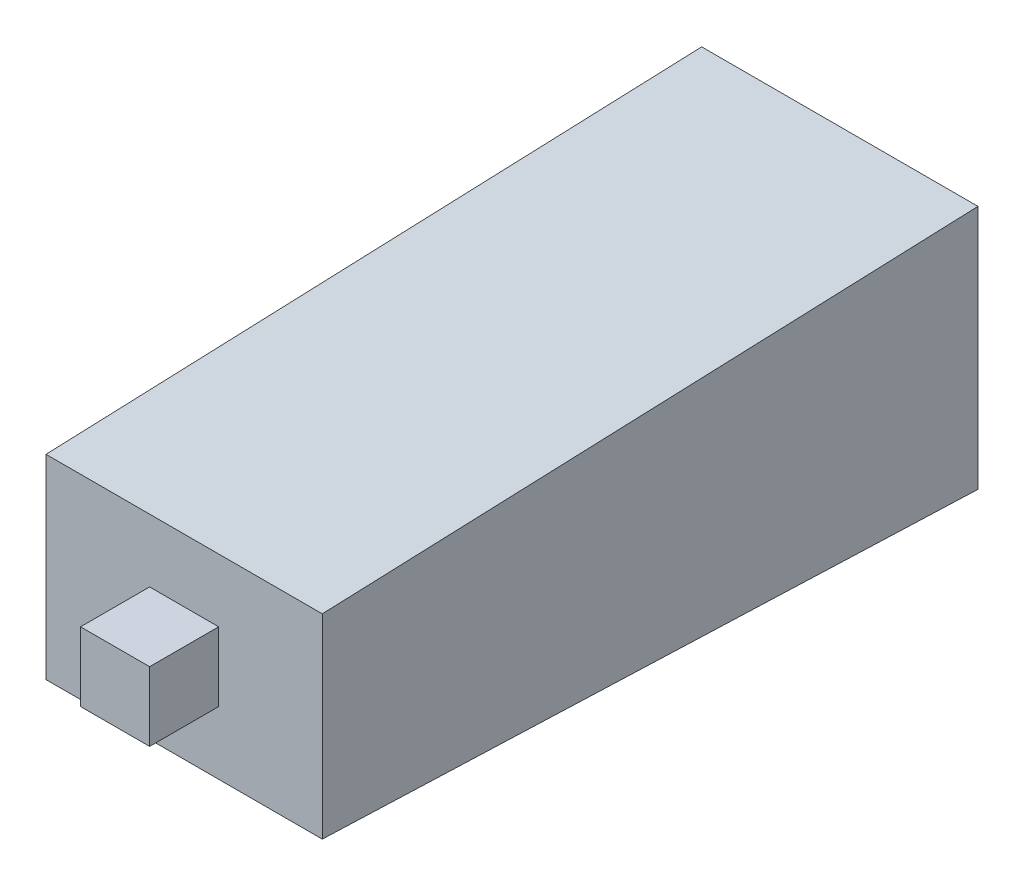
ISO-10303-21;
HEADER;
FILE_DESCRIPTION(('STEP AP214'),'2;1');
FILE_NAME('part.step','',(''),(''),'','','');
FILE_SCHEMA(('AUTOMOTIVE_DESIGN { 1 0 10303 214 1 1 1 1 }'));
ENDSEC;
DATA;
#1=APPLICATION_CONTEXT('core data for automotive mechanical design processes');
#2=APPLICATION_PROTOCOL_DEFINITION('international standard','automotive_design',2000,#1);
#3=PRODUCT_CONTEXT('',#1,'mechanical');
#4=PRODUCT('Part','Part','',(#3));
#5=PRODUCT_RELATED_PRODUCT_CATEGORY('part','',(#4));
#6=PRODUCT_DEFINITION_FORMATION('','',#4);
#7=PRODUCT_DEFINITION_CONTEXT('part definition',#1,'design');
#8=PRODUCT_DEFINITION('design','',#6,#7);
#9=PRODUCT_DEFINITION_SHAPE('','',#8);
#10=(LENGTH_UNIT() NAMED_UNIT(*) SI_UNIT(.MILLI.,.METRE.));
#11=(NAMED_UNIT(*) PLANE_ANGLE_UNIT() SI_UNIT($,.RADIAN.));
#12=(NAMED_UNIT(*) SI_UNIT($,.STERADIAN.) SOLID_ANGLE_UNIT());
#13=UNCERTAINTY_MEASURE_WITH_UNIT(LENGTH_MEASURE(1.E-05),#10,'distance_accuracy_value','');
#14=(GEOMETRIC_REPRESENTATION_CONTEXT(3) GLOBAL_UNCERTAINTY_ASSIGNED_CONTEXT((#13)) GLOBAL_UNIT_ASSIGNED_CONTEXT((#10,
#11,#12)) REPRESENTATION_CONTEXT('',''));
#15=CARTESIAN_POINT('',(0.,0.,0.));
#16=DIRECTION('',(0.,0.,1.));
#17=DIRECTION('',(1.,0.,0.));
#18=AXIS2_PLACEMENT_3D('',#15,#16,#17);
#19=CARTESIAN_POINT('',(2.98182289682424E-13,-0.0380714095059369,429.721988940198));
#20=DIRECTION('',(0.,8.8595441556101E-05,-0.999999996075424));
#21=DIRECTION('',(0.,0.999999996075424,8.8595441556101E-05));
#22=AXIS2_PLACEMENT_3D('',#19,#20,#21);
#23=PLANE('',#22);
#24=DIRECTION('',(0.,0.999999996075424,8.8595441556101E-05));
#25=VECTOR('',#24,1.);
#26=CARTESIAN_POINT('',(-34.3112297254508,-68.3291397741746,429.715938662818));
#27=LINE('',#26,#25);
#28=CARTESIAN_POINT('',(-34.3112297254508,-53.8157140484837,429.717224486183));
#29=VERTEX_POINT('',#28);
#30=CARTESIAN_POINT('',(-34.3112297254508,17.1492207142147,429.723511655938));
#31=VERTEX_POINT('',#30);
#32=EDGE_CURVE('E227',#29,#31,#27,.T.);
#33=ORIENTED_EDGE('',*,*,#32,.T.);
#34=DIRECTION('',(1.,0.,0.));
#35=VECTOR('',#34,1.);
#36=CARTESIAN_POINT('',(-74.3112297254505,17.1492207142147,429.723511655938));
#37=LINE('',#36,#35);
#38=CARTESIAN_POINT('',(45.6887702745492,17.1492207142147,429.723511655938));
#39=VERTEX_POINT('',#38);
#40=EDGE_CURVE('E44',#31,#39,#37,.T.);
#41=ORIENTED_EDGE('',*,*,#40,.T.);
#42=DIRECTION('',(0.,-0.999999996075424,-8.8595441556101E-05));
#43=VECTOR('',#42,1.);
#44=CARTESIAN_POINT('',(45.6887702745492,31.6708594409101,429.724798206938));
#45=LINE('',#44,#43);
#46=CARTESIAN_POINT('',(45.6887702745492,-53.8157140484837,429.717224486184));
#47=VERTEX_POINT('',#46);
#48=EDGE_CURVE('E230',#39,#47,#45,.T.);
#49=ORIENTED_EDGE('',*,*,#48,.T.);
#50=DIRECTION('',(1.,0.,0.));
#51=VECTOR('',#50,1.);
#52=CARTESIAN_POINT('',(-74.3112297254505,-53.8157140484837,429.717224486184));
#53=LINE('',#52,#51);
#54=EDGE_CURVE('E215',#29,#47,#53,.T.);
#55=ORIENTED_EDGE('',*,*,#54,.F.);
#56=EDGE_LOOP('',(#33,#41,#49,#55));
#57=FACE_BOUND('',#56,.T.);
#58=DIRECTION('',(-1.,0.,0.));
#59=VECTOR('',#58,1.);
#60=CARTESIAN_POINT('',(15.9387702745492,-28.5832466269076,429.719459967785));
#61=LINE('',#60,#59);
#62=CARTESIAN_POINT('',(15.9387702745492,-28.5832466269076,429.719459967785));
#63=VERTEX_POINT('',#62);
#64=CARTESIAN_POINT('',(-4.56122972545079,-28.5832466269076,429.719459967785));
#65=VERTEX_POINT('',#64);
#66=EDGE_CURVE('E149',#63,#65,#61,.T.);
#67=ORIENTED_EDGE('',*,*,#66,.F.);
#68=DIRECTION('',(0.,0.999999996075424,8.85954415548553E-05));
#69=VECTOR('',#68,1.);
#70=CARTESIAN_POINT('',(15.9387702745492,-28.5832466269076,429.719459967785));
#71=LINE('',#70,#69);
#72=CARTESIAN_POINT('',(15.9387702745492,-8.0832467073614,429.721276174337));
#73=VERTEX_POINT('',#72);
#74=EDGE_CURVE('E57',#63,#73,#71,.T.);
#75=ORIENTED_EDGE('',*,*,#74,.T.);
#76=DIRECTION('',(-1.,0.,0.));
#77=VECTOR('',#76,1.);
#78=CARTESIAN_POINT('',(15.9387702745492,-8.0832467073614,429.721276174337));
#79=LINE('',#78,#77);
#80=CARTESIAN_POINT('',(-4.56122972545079,-8.08324670736139,429.721276174337));
#81=VERTEX_POINT('',#80);
#82=EDGE_CURVE('E153',#73,#81,#79,.T.);
#83=ORIENTED_EDGE('',*,*,#82,.T.);
#84=DIRECTION('',(0.,0.999999996075424,8.85954415548552E-05));
#85=VECTOR('',#84,1.);
#86=CARTESIAN_POINT('',(-4.56122972545079,-28.5832466269076,429.719459967785));
#87=LINE('',#86,#85);
#88=EDGE_CURVE('E403',#65,#81,#87,.T.);
#89=ORIENTED_EDGE('',*,*,#88,.F.);
#90=EDGE_LOOP('',(#67,#75,#83,#89));
#91=FACE_BOUND('',#90,.T.);
#92=ADVANCED_FACE('F40',(#57,#91),#23,.T.);
#93=CARTESIAN_POINT('',(0.,-0.0548923524131538,619.584385296464));
#94=DIRECTION('',(0.,8.85954415579071E-05,-0.999999996075424));
#95=DIRECTION('',(0.,0.999999996075424,8.85954415579071E-05));
#96=AXIS2_PLACEMENT_3D('',#93,#94,#95);
#97=PLANE('',#96);
#98=DIRECTION('',(1.,0.,0.));
#99=VECTOR('',#98,1.);
#100=CARTESIAN_POINT('',(-4.36811165867164E-13,-8.35004325830691,619.583650383904));
#101=LINE('',#100,#99);
#102=CARTESIAN_POINT('',(-4.3112297254508,-8.35004325830691,619.583650383904));
#103=VERTEX_POINT('',#102);
#104=CARTESIAN_POINT('',(15.6887702745492,-8.35004325830691,619.583650383904));
#105=VERTEX_POINT('',#104);
#106=EDGE_CURVE('E159',#103,#105,#101,.T.);
#107=ORIENTED_EDGE('',*,*,#106,.T.);
#108=DIRECTION('',(0.,-0.999999996075424,-8.85954415581177E-05));
#109=VECTOR('',#108,1.);
#110=CARTESIAN_POINT('',(15.6887702745492,-0.0548923524132844,619.584385296464));
#111=LINE('',#110,#109);
#112=CARTESIAN_POINT('',(15.6887702745492,-28.3500431798154,619.581878475073));
#113=VERTEX_POINT('',#112);
#114=EDGE_CURVE('E65',#105,#113,#111,.T.);
#115=ORIENTED_EDGE('',*,*,#114,.T.);
#116=DIRECTION('',(1.,0.,0.));
#117=VECTOR('',#116,1.);
#118=CARTESIAN_POINT('',(-4.37530655517826E-13,-28.3500431798154,619.581878475073));
#119=LINE('',#118,#117);
#120=CARTESIAN_POINT('',(-4.3112297254508,-28.3500456807355,619.581878474851));
#121=VERTEX_POINT('',#120);
#122=EDGE_CURVE('E170',#121,#113,#119,.T.);
#123=ORIENTED_EDGE('',*,*,#122,.F.);
#124=DIRECTION('',(0.,-0.999999996075424,-8.85954415581177E-05));
#125=VECTOR('',#124,1.);
#126=CARTESIAN_POINT('',(-4.3112297254508,-0.0548923524132847,619.584385296464));
#127=LINE('',#126,#125);
#128=EDGE_CURVE('E184',#103,#121,#127,.T.);
#129=ORIENTED_EDGE('',*,*,#128,.F.);
#130=EDGE_LOOP('',(#107,#115,#123,#129));
#131=FACE_BOUND('',#130,.T.);
#132=DIRECTION('',(0.,0.999999996075424,8.85954415579071E-05));
#133=VECTOR('',#132,1.);
#134=CARTESIAN_POINT('',(-34.3112297254508,-68.3459607170805,619.578335019084));
#135=LINE('',#134,#133);
#136=CARTESIAN_POINT('',(-34.3112297254508,-46.6026752505061,619.580261375068));
#137=VERTEX_POINT('',#136);
#138=CARTESIAN_POINT('',(-34.3112297254508,9.9025888123838,619.585267483908));
#139=VERTEX_POINT('',#138);
#140=EDGE_CURVE('E223',#137,#139,#135,.T.);
#141=ORIENTED_EDGE('',*,*,#140,.F.);
#142=DIRECTION('',(1.,0.,0.));
#143=VECTOR('',#142,1.);
#144=CARTESIAN_POINT('',(-74.3112297254508,-46.6026752505061,619.580261375068));
#145=LINE('',#144,#143);
#146=CARTESIAN_POINT('',(45.6887702745492,-46.6026752505061,619.580261375068));
#147=VERTEX_POINT('',#146);
#148=EDGE_CURVE('E11',#137,#147,#145,.T.);
#149=ORIENTED_EDGE('',*,*,#148,.T.);
#150=DIRECTION('',(0.,-0.999999996075424,-8.85954415579071E-05));
#151=VECTOR('',#150,1.);
#152=CARTESIAN_POINT('',(45.6887702745492,31.6540384980043,619.587194563205));
#153=LINE('',#152,#151);
#154=CARTESIAN_POINT('',(45.6887702745492,9.90258881238379,619.585267483908));
#155=VERTEX_POINT('',#154);
#156=EDGE_CURVE('E220',#155,#147,#153,.T.);
#157=ORIENTED_EDGE('',*,*,#156,.F.);
#158=DIRECTION('',(1.,0.,0.));
#159=VECTOR('',#158,1.);
#160=CARTESIAN_POINT('',(-74.3112297254508,9.90258881238379,619.585267483908));
#161=LINE('',#160,#159);
#162=EDGE_CURVE('E219',#139,#155,#161,.T.);
#163=ORIENTED_EDGE('',*,*,#162,.F.);
#164=EDGE_LOOP('',(#141,#149,#157,#163));
#165=FACE_BOUND('',#164,.T.);
#166=ADVANCED_FACE('F42',(#131,#165),#97,.F.);
#167=CARTESIAN_POINT('',(45.6887702745492,31.6424845178765,750.));
#168=DIRECTION('',(-1.,0.,0.));
#169=DIRECTION('',(0.,0.,1.));
#170=AXIS2_PLACEMENT_3D('',#167,#168,#169);
#171=PLANE('',#170);
#172=ORIENTED_EDGE('',*,*,#48,.F.);
#173=DIRECTION('',(0.,0.0381401679043731,-0.999272399094574));
#174=VECTOR('',#173,1.);
#175=CARTESIAN_POINT('',(45.6887702745492,33.5020759229185,1.27870518789766));
#176=LINE('',#175,#174);
#177=EDGE_CURVE('E202',#155,#39,#176,.T.);
#178=ORIENTED_EDGE('',*,*,#177,.F.);
#179=ORIENTED_EDGE('',*,*,#156,.T.);
#180=DIRECTION('',(0.,-0.0379633617237289,-0.999279131757805));
#181=VECTOR('',#180,1.);
#182=CARTESIAN_POINT('',(45.6887702745492,-70.039904475994,2.66086836421801));
#183=LINE('',#182,#181);
#184=EDGE_CURVE('E203',#147,#47,#183,.T.);
#185=ORIENTED_EDGE('',*,*,#184,.T.);
#186=EDGE_LOOP('',(#172,#178,#179,#185));
#187=FACE_BOUND('',#186,.T.);
#188=ADVANCED_FACE('F250',(#187),#171,.F.);
#189=CARTESIAN_POINT('',(-34.3112297254508,-68.3575154821235,750.));
#190=DIRECTION('',(1.,0.,0.));
#191=DIRECTION('',(0.,1.,0.));
#192=AXIS2_PLACEMENT_3D('',#189,#190,#191);
#193=PLANE('',#192);
#194=ORIENTED_EDGE('',*,*,#32,.F.);
#195=DIRECTION('',(0.,-0.0379633617237289,-0.999279131757805));
#196=VECTOR('',#195,1.);
#197=CARTESIAN_POINT('',(-34.3112297254508,-41.6864261215724,748.986745363951));
#198=LINE('',#197,#196);
#199=EDGE_CURVE('E207',#137,#29,#198,.T.);
#200=ORIENTED_EDGE('',*,*,#199,.F.);
#201=ORIENTED_EDGE('',*,*,#140,.T.);
#202=DIRECTION('',(0.,0.0381401679043731,-0.999272399094574));
#203=VECTOR('',#202,1.);
#204=CARTESIAN_POINT('',(-34.3112297254508,4.81832531852815,752.792971022926));
#205=LINE('',#204,#203);
#206=EDGE_CURVE('E213',#139,#31,#205,.T.);
#207=ORIENTED_EDGE('',*,*,#206,.T.);
#208=EDGE_LOOP('',(#194,#200,#201,#207));
#209=FACE_BOUND('',#208,.T.);
#210=ADVANCED_FACE('F255',(#209),#193,.F.);
#211=CARTESIAN_POINT('',(-74.3112297254508,-70.039904475994,2.66086836421801));
#212=DIRECTION('',(0.,-0.999279131757805,0.0379633617237289));
#213=DIRECTION('',(0.,-0.0379633617237289,-0.999279131757805));
#214=AXIS2_PLACEMENT_3D('',#211,#212,#213);
#215=PLANE('',#214);
#216=ORIENTED_EDGE('',*,*,#199,.T.);
#217=ORIENTED_EDGE('',*,*,#54,.T.);
#218=ORIENTED_EDGE('',*,*,#184,.F.);
#219=ORIENTED_EDGE('',*,*,#148,.F.);
#220=EDGE_LOOP('',(#216,#217,#218,#219));
#221=FACE_BOUND('',#220,.T.);
#222=ADVANCED_FACE('F253',(#221),#215,.T.);
#223=CARTESIAN_POINT('',(-74.3112297254508,33.5020759229185,1.27870518789766));
#224=DIRECTION('',(0.,-0.999272399094574,-0.0381401679043731));
#225=DIRECTION('',(0.,0.0381401679043731,-0.999272399094574));
#226=AXIS2_PLACEMENT_3D('',#223,#224,#225);
#227=PLANE('',#226);
#228=ORIENTED_EDGE('',*,*,#40,.F.);
#229=ORIENTED_EDGE('',*,*,#206,.F.);
#230=ORIENTED_EDGE('',*,*,#162,.T.);
#231=ORIENTED_EDGE('',*,*,#177,.T.);
#232=EDGE_LOOP('',(#228,#229,#230,#231));
#233=FACE_BOUND('',#232,.T.);
#234=ADVANCED_FACE('F244',(#233),#227,.F.);
#235=CARTESIAN_POINT('',(15.6887702745492,-0.0566642612444425,639.584385217972));
#236=DIRECTION('',(1.,0.,0.));
#237=DIRECTION('',(0.,0.,-1.));
#238=AXIS2_PLACEMENT_3D('',#235,#236,#237);
#239=PLANE('',#238);
#240=ORIENTED_EDGE('',*,*,#114,.F.);
#241=DIRECTION('',(0.,8.85954415579071E-05,-0.999999996075424));
#242=VECTOR('',#241,1.);
#243=CARTESIAN_POINT('',(15.6887702745492,-8.35181516713807,639.583650305412));
#244=LINE('',#243,#242);
#245=CARTESIAN_POINT('',(15.6887702745492,-8.35181516713807,639.583650305412));
#246=VERTEX_POINT('',#245);
#247=EDGE_CURVE('E199',#246,#105,#244,.T.);
#248=ORIENTED_EDGE('',*,*,#247,.F.);
#249=DIRECTION('',(0.,-0.999999996075424,-8.85954415581177E-05));
#250=VECTOR('',#249,1.);
#251=CARTESIAN_POINT('',(15.6887702745492,-0.0566642612444425,639.584385217972));
#252=LINE('',#251,#250);
#253=CARTESIAN_POINT('',(15.6887702745492,-28.3518150886466,639.581878396581));
#254=VERTEX_POINT('',#253);
#255=EDGE_CURVE('E165',#246,#254,#252,.T.);
#256=ORIENTED_EDGE('',*,*,#255,.T.);
#257=DIRECTION('',(0.,8.85954415579071E-05,-0.999999996075424));
#258=VECTOR('',#257,1.);
#259=CARTESIAN_POINT('',(15.6887702745492,-28.3518150886466,639.581878396581));
#260=LINE('',#259,#258);
#261=EDGE_CURVE('E179',#254,#113,#260,.T.);
#262=ORIENTED_EDGE('',*,*,#261,.T.);
#263=EDGE_LOOP('',(#240,#248,#256,#262));
#264=FACE_BOUND('',#263,.T.);
#265=ADVANCED_FACE('F263',(#264),#239,.T.);
#266=CARTESIAN_POINT('',(-4.36810834023509E-13,-8.35181516713807,639.583650305412));
#267=DIRECTION('',(0.,0.999999996075424,8.85954415579071E-05));
#268=DIRECTION('',(0.,-8.85954415579071E-05,0.999999996075424));
#269=AXIS2_PLACEMENT_3D('',#266,#267,#268);
#270=PLANE('',#269);
#271=ORIENTED_EDGE('',*,*,#106,.F.);
#272=DIRECTION('',(0.,8.85954415579071E-05,-0.999999996075424));
#273=VECTOR('',#272,1.);
#274=CARTESIAN_POINT('',(-4.3112297254508,-8.35181516713807,639.583650305412));
#275=LINE('',#274,#273);
#276=CARTESIAN_POINT('',(-4.3112297254508,-8.35181516713807,639.583650305412));
#277=VERTEX_POINT('',#276);
#278=EDGE_CURVE('E196',#277,#103,#275,.T.);
#279=ORIENTED_EDGE('',*,*,#278,.F.);
#280=DIRECTION('',(1.,0.,0.));
#281=VECTOR('',#280,1.);
#282=CARTESIAN_POINT('',(-4.36810834023509E-13,-8.35181516713807,639.583650305412));
#283=LINE('',#282,#281);
#284=EDGE_CURVE('E169',#277,#246,#283,.T.);
#285=ORIENTED_EDGE('',*,*,#284,.T.);
#286=ORIENTED_EDGE('',*,*,#247,.T.);
#287=EDGE_LOOP('',(#271,#279,#285,#286));
#288=FACE_BOUND('',#287,.T.);
#289=ADVANCED_FACE('F271',(#288),#270,.T.);
#290=CARTESIAN_POINT('',(-4.3112297254508,-0.0566642612444429,639.584385217972));
#291=DIRECTION('',(1.,0.,0.));
#292=DIRECTION('',(0.,1.,0.));
#293=AXIS2_PLACEMENT_3D('',#290,#291,#292);
#294=PLANE('',#293);
#295=ORIENTED_EDGE('',*,*,#128,.T.);
#296=DIRECTION('',(0.,8.85954415579071E-05,-0.999999996075424));
#297=VECTOR('',#296,1.);
#298=CARTESIAN_POINT('',(-4.3112297254508,-28.3518175895666,639.581878396359));
#299=LINE('',#298,#297);
#300=CARTESIAN_POINT('',(-4.3112297254508,-28.3518175895666,639.581878396359));
#301=VERTEX_POINT('',#300);
#302=EDGE_CURVE('E192',#301,#121,#299,.T.);
#303=ORIENTED_EDGE('',*,*,#302,.F.);
#304=DIRECTION('',(0.,-0.999999996075424,-8.85954415581177E-05));
#305=VECTOR('',#304,1.);
#306=CARTESIAN_POINT('',(-4.3112297254508,-0.0566642612444429,639.584385217972));
#307=LINE('',#306,#305);
#308=EDGE_CURVE('E174',#277,#301,#307,.T.);
#309=ORIENTED_EDGE('',*,*,#308,.F.);
#310=ORIENTED_EDGE('',*,*,#278,.T.);
#311=EDGE_LOOP('',(#295,#303,#309,#310));
#312=FACE_BOUND('',#311,.T.);
#313=ADVANCED_FACE('F309',(#312),#294,.F.);
#314=CARTESIAN_POINT('',(-4.3753032367417E-13,-28.3518150886466,639.581878396581));
#315=DIRECTION('',(0.,0.999999996075424,8.85954415579071E-05));
#316=DIRECTION('',(0.,-8.85954415579071E-05,0.999999996075424));
#317=AXIS2_PLACEMENT_3D('',#314,#315,#316);
#318=PLANE('',#317);
#319=ORIENTED_EDGE('',*,*,#122,.T.);
#320=ORIENTED_EDGE('',*,*,#261,.F.);
#321=DIRECTION('',(1.,0.,0.));
#322=VECTOR('',#321,1.);
#323=CARTESIAN_POINT('',(-4.3753032367417E-13,-28.3518150886466,639.581878396581));
#324=LINE('',#323,#322);
#325=EDGE_CURVE('E177',#301,#254,#324,.T.);
#326=ORIENTED_EDGE('',*,*,#325,.F.);
#327=ORIENTED_EDGE('',*,*,#302,.T.);
#328=EDGE_LOOP('',(#319,#320,#326,#327));
#329=FACE_BOUND('',#328,.T.);
#330=ADVANCED_FACE('F318',(#329),#318,.F.);
#331=CARTESIAN_POINT('',(-4.3753032367417E-13,-0.0566642612444425,639.584385217972));
#332=DIRECTION('',(0.,-8.85954415581177E-05,0.999999996075424));
#333=DIRECTION('',(0.,-0.999999996075424,-8.85954415581177E-05));
#334=AXIS2_PLACEMENT_3D('',#331,#332,#333);
#335=PLANE('',#334);
#336=ORIENTED_EDGE('',*,*,#255,.F.);
#337=ORIENTED_EDGE('',*,*,#284,.F.);
#338=ORIENTED_EDGE('',*,*,#308,.T.);
#339=ORIENTED_EDGE('',*,*,#325,.T.);
#340=EDGE_LOOP('',(#336,#337,#338,#339));
#341=FACE_BOUND('',#340,.T.);
#342=ADVANCED_FACE('F328',(#341),#335,.T.);
#343=CARTESIAN_POINT('',(15.9387702745492,-28.5850185357387,449.719459889294));
#344=DIRECTION('',(-1.,0.,0.));
#345=DIRECTION('',(0.,0.,1.));
#346=AXIS2_PLACEMENT_3D('',#343,#344,#345);
#347=PLANE('',#346);
#348=ORIENTED_EDGE('',*,*,#74,.F.);
#349=DIRECTION('',(0.,8.8595441556101E-05,-0.999999996075424));
#350=VECTOR('',#349,1.);
#351=CARTESIAN_POINT('',(15.9387702745492,-28.5850185357387,449.719459889294));
#352=LINE('',#351,#350);
#353=CARTESIAN_POINT('',(15.9387702745492,-28.5850185357387,449.719459889294));
#354=VERTEX_POINT('',#353);
#355=EDGE_CURVE('E147',#354,#63,#352,.T.);
#356=ORIENTED_EDGE('',*,*,#355,.F.);
#357=DIRECTION('',(0.,0.999999996075424,8.85954415548553E-05));
#358=VECTOR('',#357,1.);
#359=CARTESIAN_POINT('',(15.9387702745492,-28.5850185357387,449.719459889294));
#360=LINE('',#359,#358);
#361=CARTESIAN_POINT('',(15.9387702745492,-8.08501861619252,449.721276095846));
#362=VERTEX_POINT('',#361);
#363=EDGE_CURVE('E136',#354,#362,#360,.T.);
#364=ORIENTED_EDGE('',*,*,#363,.T.);
#365=DIRECTION('',(0.,8.8595441556101E-05,-0.999999996075424));
#366=VECTOR('',#365,1.);
#367=CARTESIAN_POINT('',(15.9387702745492,-8.08501861619252,449.721276095846));
#368=LINE('',#367,#366);
#369=EDGE_CURVE('E146',#362,#73,#368,.T.);
#370=ORIENTED_EDGE('',*,*,#369,.T.);
#371=EDGE_LOOP('',(#348,#356,#364,#370));
#372=FACE_BOUND('',#371,.T.);
#373=ADVANCED_FACE('F145',(#372),#347,.T.);
#374=CARTESIAN_POINT('',(15.9387702745492,-8.08501861619252,449.721276095846));
#375=DIRECTION('',(0.,-0.999999996075424,-8.8595441556101E-05));
#376=DIRECTION('',(0.,8.8595441556101E-05,-0.999999996075424));
#377=AXIS2_PLACEMENT_3D('',#374,#375,#376);
#378=PLANE('',#377);
#379=ORIENTED_EDGE('',*,*,#82,.F.);
#380=ORIENTED_EDGE('',*,*,#369,.F.);
#381=DIRECTION('',(-1.,0.,0.));
#382=VECTOR('',#381,1.);
#383=CARTESIAN_POINT('',(15.9387702745492,-8.08501861619252,449.721276095846));
#384=LINE('',#383,#382);
#385=CARTESIAN_POINT('',(-4.56122972545078,-8.08501861619252,449.721276095846));
#386=VERTEX_POINT('',#385);
#387=EDGE_CURVE('E132',#362,#386,#384,.T.);
#388=ORIENTED_EDGE('',*,*,#387,.T.);
#389=DIRECTION('',(0.,8.8595441556101E-05,-0.999999996075424));
#390=VECTOR('',#389,1.);
#391=CARTESIAN_POINT('',(-4.56122972545078,-8.08501861619252,449.721276095846));
#392=LINE('',#391,#390);
#393=EDGE_CURVE('E155',#386,#81,#392,.T.);
#394=ORIENTED_EDGE('',*,*,#393,.T.);
#395=EDGE_LOOP('',(#379,#380,#388,#394));
#396=FACE_BOUND('',#395,.T.);
#397=ADVANCED_FACE('F151',(#396),#378,.T.);
#398=CARTESIAN_POINT('',(-4.56122972545078,-28.5850185357387,449.719459889294));
#399=DIRECTION('',(-1.,0.,0.));
#400=DIRECTION('',(0.,0.,1.));
#401=AXIS2_PLACEMENT_3D('',#398,#399,#400);
#402=PLANE('',#401);
#403=ORIENTED_EDGE('',*,*,#88,.T.);
#404=ORIENTED_EDGE('',*,*,#393,.F.);
#405=DIRECTION('',(0.,0.999999996075424,8.85954415548552E-05));
#406=VECTOR('',#405,1.);
#407=CARTESIAN_POINT('',(-4.56122972545078,-28.5850185357387,449.719459889294));
#408=LINE('',#407,#406);
#409=CARTESIAN_POINT('',(-4.56122972545078,-28.5850185357387,449.719459889294));
#410=VERTEX_POINT('',#409);
#411=EDGE_CURVE('E139',#410,#386,#408,.T.);
#412=ORIENTED_EDGE('',*,*,#411,.F.);
#413=DIRECTION('',(0.,8.8595441556101E-05,-0.999999996075424));
#414=VECTOR('',#413,1.);
#415=CARTESIAN_POINT('',(-4.56122972545078,-28.5850185357387,449.719459889294));
#416=LINE('',#415,#414);
#417=EDGE_CURVE('E161',#410,#65,#416,.T.);
#418=ORIENTED_EDGE('',*,*,#417,.T.);
#419=EDGE_LOOP('',(#403,#404,#412,#418));
#420=FACE_BOUND('',#419,.T.);
#421=ADVANCED_FACE('F364',(#420),#402,.F.);
#422=CARTESIAN_POINT('',(15.9387702745492,-28.5850185357387,449.719459889294));
#423=DIRECTION('',(0.,-0.999999996075424,-8.8595441556101E-05));
#424=DIRECTION('',(0.,8.8595441556101E-05,-0.999999996075424));
#425=AXIS2_PLACEMENT_3D('',#422,#423,#424);
#426=PLANE('',#425);
#427=ORIENTED_EDGE('',*,*,#66,.T.);
#428=ORIENTED_EDGE('',*,*,#417,.F.);
#429=DIRECTION('',(-1.,0.,0.));
#430=VECTOR('',#429,1.);
#431=CARTESIAN_POINT('',(15.9387702745492,-28.5850185357387,449.719459889294));
#432=LINE('',#431,#430);
#433=EDGE_CURVE('E413',#354,#410,#432,.T.);
#434=ORIENTED_EDGE('',*,*,#433,.F.);
#435=ORIENTED_EDGE('',*,*,#355,.T.);
#436=EDGE_LOOP('',(#427,#428,#434,#435));
#437=FACE_BOUND('',#436,.T.);
#438=ADVANCED_FACE('F373',(#437),#426,.F.);
#439=CARTESIAN_POINT('',(2.84053612947141E-13,-0.0398433183369229,449.721988861706));
#440=DIRECTION('',(0.,8.85954415557845E-05,-0.999999996075424));
#441=DIRECTION('',(0.,0.999999996075424,8.85954415557845E-05));
#442=AXIS2_PLACEMENT_3D('',#439,#440,#441);
#443=PLANE('',#442);
#444=ORIENTED_EDGE('',*,*,#363,.F.);
#445=ORIENTED_EDGE('',*,*,#433,.T.);
#446=ORIENTED_EDGE('',*,*,#411,.T.);
#447=ORIENTED_EDGE('',*,*,#387,.F.);
#448=EDGE_LOOP('',(#444,#445,#446,#447));
#449=FACE_BOUND('',#448,.T.);
#450=ADVANCED_FACE('F134',(#449),#443,.T.);
#451=CLOSED_SHELL('',(#92,#166,#188,#210,#222,#234,#265,#289,#313,#330,#342,#373,#397,#421,#438,#450));
#452=MANIFOLD_SOLID_BREP('B2',#451);
#453=ADVANCED_BREP_SHAPE_REPRESENTATION('',(#18,#452),#14);
#454=SHAPE_DEFINITION_REPRESENTATION(#9,#453);
ENDSEC;
END-ISO-10303-21;
